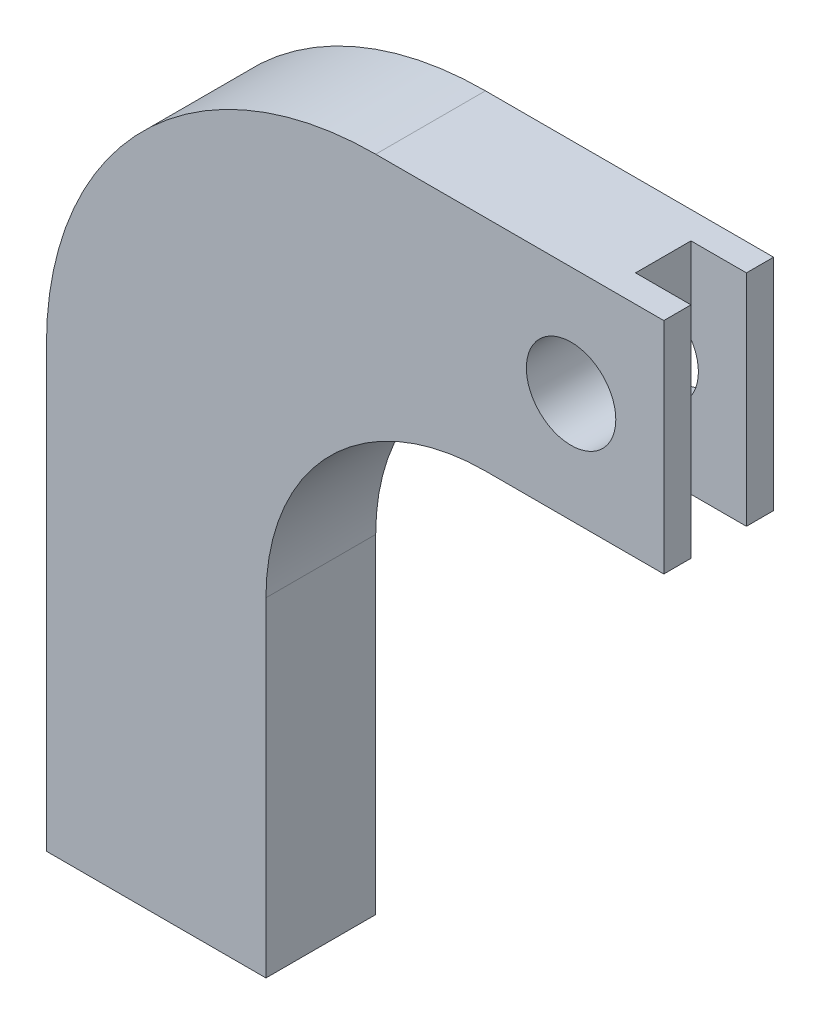
ISO-10303-21;
HEADER;
FILE_DESCRIPTION(('STEP AP214'),'2;1');
FILE_NAME('part.step','',(''),(''),'','','');
FILE_SCHEMA(('AUTOMOTIVE_DESIGN { 1 0 10303 214 1 1 1 1 }'));
ENDSEC;
DATA;
#1=APPLICATION_CONTEXT('core data for automotive mechanical design processes');
#2=APPLICATION_PROTOCOL_DEFINITION('international standard','automotive_design',2000,#1);
#3=PRODUCT_CONTEXT('',#1,'mechanical');
#4=PRODUCT('Part','Part','',(#3));
#5=PRODUCT_RELATED_PRODUCT_CATEGORY('part','',(#4));
#6=PRODUCT_DEFINITION_FORMATION('','',#4);
#7=PRODUCT_DEFINITION_CONTEXT('part definition',#1,'design');
#8=PRODUCT_DEFINITION('design','',#6,#7);
#9=PRODUCT_DEFINITION_SHAPE('','',#8);
#10=(LENGTH_UNIT() NAMED_UNIT(*) SI_UNIT(.MILLI.,.METRE.));
#11=(NAMED_UNIT(*) PLANE_ANGLE_UNIT() SI_UNIT($,.RADIAN.));
#12=(NAMED_UNIT(*) SI_UNIT($,.STERADIAN.) SOLID_ANGLE_UNIT());
#13=UNCERTAINTY_MEASURE_WITH_UNIT(LENGTH_MEASURE(1.E-05),#10,'distance_accuracy_value','');
#14=(GEOMETRIC_REPRESENTATION_CONTEXT(3) GLOBAL_UNCERTAINTY_ASSIGNED_CONTEXT((#13)) GLOBAL_UNIT_ASSIGNED_CONTEXT((#10,
#11,#12)) REPRESENTATION_CONTEXT('',''));
#15=CARTESIAN_POINT('',(0.,0.,0.));
#16=DIRECTION('',(0.,0.,1.));
#17=DIRECTION('',(1.,0.,0.));
#18=AXIS2_PLACEMENT_3D('',#15,#16,#17);
#19=CARTESIAN_POINT('',(11.25,14.,1.));
#20=DIRECTION('',(-1.,0.,0.));
#21=DIRECTION('',(0.,-1.,0.));
#22=AXIS2_PLACEMENT_3D('',#19,#20,#21);
#23=PLANE('',#22);
#24=DIRECTION('',(0.,0.,-1.));
#25=VECTOR('',#24,1.);
#26=CARTESIAN_POINT('',(11.25,10.,1.));
#27=LINE('',#26,#25);
#28=CARTESIAN_POINT('',(11.25,10.,1.));
#29=VERTEX_POINT('',#28);
#30=CARTESIAN_POINT('',(11.25,10.,0.505));
#31=VERTEX_POINT('',#30);
#32=EDGE_CURVE('E226',#29,#31,#27,.T.);
#33=ORIENTED_EDGE('',*,*,#32,.T.);
#34=DIRECTION('',(0.,-1.,0.));
#35=VECTOR('',#34,1.);
#36=CARTESIAN_POINT('',(11.25,14.,0.505));
#37=LINE('',#36,#35);
#38=CARTESIAN_POINT('',(11.25,14.,0.505));
#39=VERTEX_POINT('',#38);
#40=EDGE_CURVE('E149',#39,#31,#37,.T.);
#41=ORIENTED_EDGE('',*,*,#40,.F.);
#42=DIRECTION('',(0.,0.,-1.));
#43=VECTOR('',#42,1.);
#44=CARTESIAN_POINT('',(11.25,14.,1.));
#45=LINE('',#44,#43);
#46=CARTESIAN_POINT('',(11.25,14.,1.));
#47=VERTEX_POINT('',#46);
#48=EDGE_CURVE('E222',#47,#39,#45,.T.);
#49=ORIENTED_EDGE('',*,*,#48,.F.);
#50=DIRECTION('',(0.,1.,0.));
#51=VECTOR('',#50,1.);
#52=CARTESIAN_POINT('',(11.25,14.,1.));
#53=LINE('',#52,#51);
#54=EDGE_CURVE('E187',#29,#47,#53,.T.);
#55=ORIENTED_EDGE('',*,*,#54,.F.);
#56=EDGE_LOOP('',(#33,#41,#49,#55));
#57=FACE_BOUND('',#56,.T.);
#58=ADVANCED_FACE('F32',(#57),#23,.F.);
#59=CARTESIAN_POINT('',(9.56,12.,1.));
#60=DIRECTION('',(0.,0.,-1.));
#61=DIRECTION('',(-1.,0.,0.));
#62=AXIS2_PLACEMENT_3D('',#59,#60,#61);
#63=CYLINDRICAL_SURFACE('',#62,0.814999999999999);
#64=CARTESIAN_POINT('',(9.56,12.,1.));
#65=DIRECTION('',(0.,0.,1.));
#66=DIRECTION('',(1.,0.,0.));
#67=AXIS2_PLACEMENT_3D('',#64,#65,#66);
#68=CIRCLE('',#67,0.814999999999999);
#69=CARTESIAN_POINT('',(10.375,12.,1.));
#70=VERTEX_POINT('',#69);
#71=EDGE_CURVE('E171',#70,#70,#68,.T.);
#72=ORIENTED_EDGE('',*,*,#71,.T.);
#73=EDGE_LOOP('',(#72));
#74=FACE_BOUND('',#73,.T.);
#75=CARTESIAN_POINT('',(9.56,12.,-1.));
#76=DIRECTION('',(0.,0.,1.));
#77=DIRECTION('',(1.,0.,0.));
#78=AXIS2_PLACEMENT_3D('',#75,#76,#77);
#79=CIRCLE('',#78,0.814999999999999);
#80=CARTESIAN_POINT('',(10.375,12.,-1.));
#81=VERTEX_POINT('',#80);
#82=EDGE_CURVE('E168',#81,#81,#79,.T.);
#83=ORIENTED_EDGE('',*,*,#82,.F.);
#84=EDGE_LOOP('',(#83));
#85=FACE_BOUND('',#84,.T.);
#86=CARTESIAN_POINT('',(9.56,12.,0.505));
#87=DIRECTION('',(0.,0.,1.));
#88=DIRECTION('',(0.,-1.,0.));
#89=AXIS2_PLACEMENT_3D('',#86,#87,#88);
#90=CIRCLE('',#89,0.814999999999999);
#91=CARTESIAN_POINT('',(10.24,11.5507506260438,0.505));
#92=VERTEX_POINT('',#91);
#93=CARTESIAN_POINT('',(10.24,12.4492493739562,0.505));
#94=VERTEX_POINT('',#93);
#95=EDGE_CURVE('E40',#92,#94,#90,.T.);
#96=ORIENTED_EDGE('',*,*,#95,.F.);
#97=DIRECTION('',(0.,0.,-1.));
#98=VECTOR('',#97,1.);
#99=CARTESIAN_POINT('',(10.24,11.5507506260438,1.));
#100=LINE('',#99,#98);
#101=CARTESIAN_POINT('',(10.24,11.5507506260438,-0.505));
#102=VERTEX_POINT('',#101);
#103=EDGE_CURVE('E11',#92,#102,#100,.T.);
#104=ORIENTED_EDGE('',*,*,#103,.T.);
#105=CARTESIAN_POINT('',(9.56,12.,-0.505));
#106=DIRECTION('',(0.,0.,-1.));
#107=DIRECTION('',(0.,1.,0.));
#108=AXIS2_PLACEMENT_3D('',#105,#106,#107);
#109=CIRCLE('',#108,0.814999999999999);
#110=CARTESIAN_POINT('',(10.24,12.4492493739562,-0.505));
#111=VERTEX_POINT('',#110);
#112=EDGE_CURVE('E240',#111,#102,#109,.T.);
#113=ORIENTED_EDGE('',*,*,#112,.F.);
#114=DIRECTION('',(0.,0.,-1.));
#115=VECTOR('',#114,1.);
#116=CARTESIAN_POINT('',(10.24,12.4492493739562,1.));
#117=LINE('',#116,#115);
#118=EDGE_CURVE('E237',#111,#94,#117,.F.);
#119=ORIENTED_EDGE('',*,*,#118,.T.);
#120=EDGE_LOOP('',(#96,#104,#113,#119));
#121=FACE_BOUND('',#120,.T.);
#122=ADVANCED_FACE('F243',(#74,#85,#121),#63,.F.);
#123=CARTESIAN_POINT('',(6.,8.,1.));
#124=DIRECTION('',(0.,0.,-1.));
#125=DIRECTION('',(-1.,0.,0.));
#126=AXIS2_PLACEMENT_3D('',#123,#124,#125);
#127=PLANE('',#126);
#128=DIRECTION('',(1.,0.,0.));
#129=VECTOR('',#128,1.);
#130=CARTESIAN_POINT('',(4.,0.,1.));
#131=LINE('',#130,#129);
#132=CARTESIAN_POINT('',(0.,0.,1.));
#133=VERTEX_POINT('',#132);
#134=CARTESIAN_POINT('',(4.,0.,1.));
#135=VERTEX_POINT('',#134);
#136=EDGE_CURVE('E177',#133,#135,#131,.T.);
#137=ORIENTED_EDGE('',*,*,#136,.T.);
#138=DIRECTION('',(0.,1.,0.));
#139=VECTOR('',#138,1.);
#140=CARTESIAN_POINT('',(4.,5.99999999999997,1.));
#141=LINE('',#140,#139);
#142=CARTESIAN_POINT('',(4.,5.99999999999997,1.));
#143=VERTEX_POINT('',#142);
#144=EDGE_CURVE('E180',#135,#143,#141,.T.);
#145=ORIENTED_EDGE('',*,*,#144,.T.);
#146=CARTESIAN_POINT('',(8.,6.,1.));
#147=DIRECTION('',(0.,0.,-1.));
#148=DIRECTION('',(1.,0.,0.));
#149=AXIS2_PLACEMENT_3D('',#146,#147,#148);
#150=CIRCLE('',#149,4.);
#151=CARTESIAN_POINT('',(8.00000000000003,10.,1.));
#152=VERTEX_POINT('',#151);
#153=EDGE_CURVE('E183',#143,#152,#150,.T.);
#154=ORIENTED_EDGE('',*,*,#153,.T.);
#155=DIRECTION('',(1.,0.,0.));
#156=VECTOR('',#155,1.);
#157=CARTESIAN_POINT('',(11.25,10.,1.));
#158=LINE('',#157,#156);
#159=EDGE_CURVE('E185',#152,#29,#158,.T.);
#160=ORIENTED_EDGE('',*,*,#159,.T.);
#161=ORIENTED_EDGE('',*,*,#54,.T.);
#162=DIRECTION('',(-1.,0.,0.));
#163=VECTOR('',#162,1.);
#164=CARTESIAN_POINT('',(6.,14.,1.));
#165=LINE('',#164,#163);
#166=CARTESIAN_POINT('',(6.,14.,1.));
#167=VERTEX_POINT('',#166);
#168=EDGE_CURVE('E189',#47,#167,#165,.T.);
#169=ORIENTED_EDGE('',*,*,#168,.T.);
#170=CARTESIAN_POINT('',(6.,8.,1.));
#171=DIRECTION('',(0.,0.,1.));
#172=DIRECTION('',(-1.,0.,0.));
#173=AXIS2_PLACEMENT_3D('',#170,#171,#172);
#174=CIRCLE('',#173,6.);
#175=CARTESIAN_POINT('',(0.,8.,1.));
#176=VERTEX_POINT('',#175);
#177=EDGE_CURVE('E191',#167,#176,#174,.T.);
#178=ORIENTED_EDGE('',*,*,#177,.T.);
#179=DIRECTION('',(0.,-1.,0.));
#180=VECTOR('',#179,1.);
#181=CARTESIAN_POINT('',(0.,0.,1.));
#182=LINE('',#181,#180);
#183=EDGE_CURVE('E193',#176,#133,#182,.T.);
#184=ORIENTED_EDGE('',*,*,#183,.T.);
#185=EDGE_LOOP('',(#137,#145,#154,#160,#161,#169,#178,#184));
#186=FACE_BOUND('',#185,.T.);
#187=ORIENTED_EDGE('',*,*,#71,.F.);
#188=EDGE_LOOP('',(#187));
#189=FACE_BOUND('',#188,.T.);
#190=ADVANCED_FACE('F273',(#186,#189),#127,.F.);
#191=CARTESIAN_POINT('',(6.,8.,-1.));
#192=DIRECTION('',(0.,0.,-1.));
#193=DIRECTION('',(-1.,0.,0.));
#194=AXIS2_PLACEMENT_3D('',#191,#192,#193);
#195=PLANE('',#194);
#196=DIRECTION('',(1.,0.,0.));
#197=VECTOR('',#196,1.);
#198=CARTESIAN_POINT('',(4.,0.,-1.));
#199=LINE('',#198,#197);
#200=CARTESIAN_POINT('',(0.,0.,-1.));
#201=VERTEX_POINT('',#200);
#202=CARTESIAN_POINT('',(4.,0.,-1.));
#203=VERTEX_POINT('',#202);
#204=EDGE_CURVE('E174',#201,#203,#199,.T.);
#205=ORIENTED_EDGE('',*,*,#204,.F.);
#206=DIRECTION('',(0.,-1.,0.));
#207=VECTOR('',#206,1.);
#208=CARTESIAN_POINT('',(0.,0.,-1.));
#209=LINE('',#208,#207);
#210=CARTESIAN_POINT('',(0.,8.,-1.));
#211=VERTEX_POINT('',#210);
#212=EDGE_CURVE('E181',#211,#201,#209,.T.);
#213=ORIENTED_EDGE('',*,*,#212,.F.);
#214=CARTESIAN_POINT('',(6.,8.,-1.));
#215=DIRECTION('',(0.,0.,1.));
#216=DIRECTION('',(-1.,0.,0.));
#217=AXIS2_PLACEMENT_3D('',#214,#215,#216);
#218=CIRCLE('',#217,6.);
#219=CARTESIAN_POINT('',(6.,14.,-1.));
#220=VERTEX_POINT('',#219);
#221=EDGE_CURVE('E210',#220,#211,#218,.T.);
#222=ORIENTED_EDGE('',*,*,#221,.F.);
#223=DIRECTION('',(-1.,0.,0.));
#224=VECTOR('',#223,1.);
#225=CARTESIAN_POINT('',(6.,14.,-1.));
#226=LINE('',#225,#224);
#227=CARTESIAN_POINT('',(11.25,14.,-1.));
#228=VERTEX_POINT('',#227);
#229=EDGE_CURVE('E208',#228,#220,#226,.T.);
#230=ORIENTED_EDGE('',*,*,#229,.F.);
#231=DIRECTION('',(0.,1.,0.));
#232=VECTOR('',#231,1.);
#233=CARTESIAN_POINT('',(11.25,14.,-1.));
#234=LINE('',#233,#232);
#235=CARTESIAN_POINT('',(11.25,10.,-1.));
#236=VERTEX_POINT('',#235);
#237=EDGE_CURVE('E205',#236,#228,#234,.T.);
#238=ORIENTED_EDGE('',*,*,#237,.F.);
#239=DIRECTION('',(1.,0.,0.));
#240=VECTOR('',#239,1.);
#241=CARTESIAN_POINT('',(11.25,10.,-1.));
#242=LINE('',#241,#240);
#243=CARTESIAN_POINT('',(8.00000000000003,10.,-1.));
#244=VERTEX_POINT('',#243);
#245=EDGE_CURVE('E202',#244,#236,#242,.T.);
#246=ORIENTED_EDGE('',*,*,#245,.F.);
#247=CARTESIAN_POINT('',(8.,6.,-1.));
#248=DIRECTION('',(0.,0.,-1.));
#249=DIRECTION('',(1.,0.,0.));
#250=AXIS2_PLACEMENT_3D('',#247,#248,#249);
#251=CIRCLE('',#250,4.);
#252=CARTESIAN_POINT('',(4.,5.99999999999997,-1.));
#253=VERTEX_POINT('',#252);
#254=EDGE_CURVE('E200',#253,#244,#251,.T.);
#255=ORIENTED_EDGE('',*,*,#254,.F.);
#256=DIRECTION('',(0.,1.,0.));
#257=VECTOR('',#256,1.);
#258=CARTESIAN_POINT('',(4.,5.99999999999997,-1.));
#259=LINE('',#258,#257);
#260=EDGE_CURVE('E198',#203,#253,#259,.T.);
#261=ORIENTED_EDGE('',*,*,#260,.F.);
#262=EDGE_LOOP('',(#205,#213,#222,#230,#238,#246,#255,#261));
#263=FACE_BOUND('',#262,.T.);
#264=ORIENTED_EDGE('',*,*,#82,.T.);
#265=EDGE_LOOP('',(#264));
#266=FACE_BOUND('',#265,.T.);
#267=ADVANCED_FACE('F259',(#263,#266),#195,.T.);
#268=CARTESIAN_POINT('',(4.,0.,1.));
#269=DIRECTION('',(0.,1.,0.));
#270=DIRECTION('',(-1.,0.,0.));
#271=AXIS2_PLACEMENT_3D('',#268,#269,#270);
#272=PLANE('',#271);
#273=ORIENTED_EDGE('',*,*,#204,.T.);
#274=DIRECTION('',(0.,0.,-1.));
#275=VECTOR('',#274,1.);
#276=CARTESIAN_POINT('',(4.,0.,1.));
#277=LINE('',#276,#275);
#278=EDGE_CURVE('E234',#135,#203,#277,.T.);
#279=ORIENTED_EDGE('',*,*,#278,.F.);
#280=ORIENTED_EDGE('',*,*,#136,.F.);
#281=DIRECTION('',(0.,0.,-1.));
#282=VECTOR('',#281,1.);
#283=CARTESIAN_POINT('',(0.,0.,1.));
#284=LINE('',#283,#282);
#285=EDGE_CURVE('E195',#133,#201,#284,.T.);
#286=ORIENTED_EDGE('',*,*,#285,.T.);
#287=EDGE_LOOP('',(#273,#279,#280,#286));
#288=FACE_BOUND('',#287,.T.);
#289=ADVANCED_FACE('F34',(#288),#272,.F.);
#290=CARTESIAN_POINT('',(4.,5.99999999999997,1.));
#291=DIRECTION('',(-1.,0.,0.));
#292=DIRECTION('',(0.,0.,1.));
#293=AXIS2_PLACEMENT_3D('',#290,#291,#292);
#294=PLANE('',#293);
#295=ORIENTED_EDGE('',*,*,#260,.T.);
#296=DIRECTION('',(0.,0.,-1.));
#297=VECTOR('',#296,1.);
#298=CARTESIAN_POINT('',(4.,5.99999999999997,1.));
#299=LINE('',#298,#297);
#300=EDGE_CURVE('E231',#143,#253,#299,.T.);
#301=ORIENTED_EDGE('',*,*,#300,.F.);
#302=ORIENTED_EDGE('',*,*,#144,.F.);
#303=ORIENTED_EDGE('',*,*,#278,.T.);
#304=EDGE_LOOP('',(#295,#301,#302,#303));
#305=FACE_BOUND('',#304,.T.);
#306=ADVANCED_FACE('F286',(#305),#294,.F.);
#307=CARTESIAN_POINT('',(8.,6.,1.));
#308=DIRECTION('',(0.,0.,-1.));
#309=DIRECTION('',(-1.,0.,0.));
#310=AXIS2_PLACEMENT_3D('',#307,#308,#309);
#311=CYLINDRICAL_SURFACE('',#310,4.);
#312=ORIENTED_EDGE('',*,*,#254,.T.);
#313=DIRECTION('',(0.,0.,-1.));
#314=VECTOR('',#313,1.);
#315=CARTESIAN_POINT('',(8.00000000000003,10.,1.));
#316=LINE('',#315,#314);
#317=EDGE_CURVE('E228',#152,#244,#316,.T.);
#318=ORIENTED_EDGE('',*,*,#317,.F.);
#319=ORIENTED_EDGE('',*,*,#153,.F.);
#320=ORIENTED_EDGE('',*,*,#300,.T.);
#321=EDGE_LOOP('',(#312,#318,#319,#320));
#322=FACE_BOUND('',#321,.T.);
#323=ADVANCED_FACE('F283',(#322),#311,.F.);
#324=CARTESIAN_POINT('',(11.25,10.,1.));
#325=DIRECTION('',(0.,1.,0.));
#326=DIRECTION('',(0.,0.,1.));
#327=AXIS2_PLACEMENT_3D('',#324,#325,#326);
#328=PLANE('',#327);
#329=DIRECTION('',(0.,0.,-1.));
#330=VECTOR('',#329,1.);
#331=CARTESIAN_POINT('',(10.24,10.,0.505));
#332=LINE('',#331,#330);
#333=CARTESIAN_POINT('',(10.24,10.,0.505));
#334=VERTEX_POINT('',#333);
#335=CARTESIAN_POINT('',(10.24,10.,-0.505000000000001));
#336=VERTEX_POINT('',#335);
#337=EDGE_CURVE('E139',#334,#336,#332,.T.);
#338=ORIENTED_EDGE('',*,*,#337,.F.);
#339=DIRECTION('',(1.,0.,0.));
#340=VECTOR('',#339,1.);
#341=CARTESIAN_POINT('',(10.24,10.,0.505));
#342=LINE('',#341,#340);
#343=EDGE_CURVE('E146',#334,#31,#342,.T.);
#344=ORIENTED_EDGE('',*,*,#343,.T.);
#345=ORIENTED_EDGE('',*,*,#32,.F.);
#346=ORIENTED_EDGE('',*,*,#159,.F.);
#347=ORIENTED_EDGE('',*,*,#317,.T.);
#348=ORIENTED_EDGE('',*,*,#245,.T.);
#349=CARTESIAN_POINT('',(11.25,10.,-0.505000000000001));
#350=VERTEX_POINT('',#349);
#351=EDGE_CURVE('E225',#350,#236,#27,.T.);
#352=ORIENTED_EDGE('',*,*,#351,.F.);
#353=DIRECTION('',(1.,0.,0.));
#354=VECTOR('',#353,1.);
#355=CARTESIAN_POINT('',(10.24,10.,-0.505000000000001));
#356=LINE('',#355,#354);
#357=EDGE_CURVE('E153',#336,#350,#356,.T.);
#358=ORIENTED_EDGE('',*,*,#357,.F.);
#359=EDGE_LOOP('',(#338,#344,#345,#346,#347,#348,#352,#358));
#360=FACE_BOUND('',#359,.T.);
#361=ADVANCED_FACE('F156',(#360),#328,.F.);
#362=CARTESIAN_POINT('',(11.25,14.,-0.505));
#363=VERTEX_POINT('',#362);
#364=EDGE_CURVE('E221',#363,#228,#45,.T.);
#365=ORIENTED_EDGE('',*,*,#364,.F.);
#366=DIRECTION('',(0.,1.,0.));
#367=VECTOR('',#366,1.);
#368=CARTESIAN_POINT('',(11.25,14.,-0.505));
#369=LINE('',#368,#367);
#370=EDGE_CURVE('E143',#350,#363,#369,.T.);
#371=ORIENTED_EDGE('',*,*,#370,.F.);
#372=ORIENTED_EDGE('',*,*,#351,.T.);
#373=ORIENTED_EDGE('',*,*,#237,.T.);
#374=EDGE_LOOP('',(#365,#371,#372,#373));
#375=FACE_BOUND('',#374,.T.);
#376=ADVANCED_FACE('F250',(#375),#23,.F.);
#377=CARTESIAN_POINT('',(6.,14.,1.));
#378=DIRECTION('',(0.,-1.,0.));
#379=DIRECTION('',(1.,0.,0.));
#380=AXIS2_PLACEMENT_3D('',#377,#378,#379);
#381=PLANE('',#380);
#382=ORIENTED_EDGE('',*,*,#48,.T.);
#383=DIRECTION('',(1.,0.,0.));
#384=VECTOR('',#383,1.);
#385=CARTESIAN_POINT('',(10.24,14.,0.505));
#386=LINE('',#385,#384);
#387=CARTESIAN_POINT('',(10.24,14.,0.505));
#388=VERTEX_POINT('',#387);
#389=EDGE_CURVE('E166',#388,#39,#386,.T.);
#390=ORIENTED_EDGE('',*,*,#389,.F.);
#391=DIRECTION('',(0.,0.,1.));
#392=VECTOR('',#391,1.);
#393=CARTESIAN_POINT('',(10.24,14.,0.505));
#394=LINE('',#393,#392);
#395=CARTESIAN_POINT('',(10.24,14.,-0.505000000000001));
#396=VERTEX_POINT('',#395);
#397=EDGE_CURVE('E154',#396,#388,#394,.T.);
#398=ORIENTED_EDGE('',*,*,#397,.F.);
#399=DIRECTION('',(1.,0.,0.));
#400=VECTOR('',#399,1.);
#401=CARTESIAN_POINT('',(10.24,14.,-0.505));
#402=LINE('',#401,#400);
#403=EDGE_CURVE('E47',#396,#363,#402,.T.);
#404=ORIENTED_EDGE('',*,*,#403,.T.);
#405=ORIENTED_EDGE('',*,*,#364,.T.);
#406=ORIENTED_EDGE('',*,*,#229,.T.);
#407=DIRECTION('',(0.,0.,-1.));
#408=VECTOR('',#407,1.);
#409=CARTESIAN_POINT('',(6.,14.,1.));
#410=LINE('',#409,#408);
#411=EDGE_CURVE('E218',#167,#220,#410,.T.);
#412=ORIENTED_EDGE('',*,*,#411,.F.);
#413=ORIENTED_EDGE('',*,*,#168,.F.);
#414=EDGE_LOOP('',(#382,#390,#398,#404,#405,#406,#412,#413));
#415=FACE_BOUND('',#414,.T.);
#416=ADVANCED_FACE('F265',(#415),#381,.F.);
#417=CARTESIAN_POINT('',(6.,8.,1.));
#418=DIRECTION('',(0.,0.,-1.));
#419=DIRECTION('',(-1.,0.,0.));
#420=AXIS2_PLACEMENT_3D('',#417,#418,#419);
#421=CYLINDRICAL_SURFACE('',#420,6.);
#422=ORIENTED_EDGE('',*,*,#221,.T.);
#423=DIRECTION('',(0.,0.,-1.));
#424=VECTOR('',#423,1.);
#425=CARTESIAN_POINT('',(0.,8.,1.));
#426=LINE('',#425,#424);
#427=EDGE_CURVE('E215',#176,#211,#426,.T.);
#428=ORIENTED_EDGE('',*,*,#427,.F.);
#429=ORIENTED_EDGE('',*,*,#177,.F.);
#430=ORIENTED_EDGE('',*,*,#411,.T.);
#431=EDGE_LOOP('',(#422,#428,#429,#430));
#432=FACE_BOUND('',#431,.T.);
#433=ADVANCED_FACE('F269',(#432),#421,.T.);
#434=CARTESIAN_POINT('',(0.,0.,1.));
#435=DIRECTION('',(1.,0.,0.));
#436=DIRECTION('',(0.,0.,-1.));
#437=AXIS2_PLACEMENT_3D('',#434,#435,#436);
#438=PLANE('',#437);
#439=ORIENTED_EDGE('',*,*,#212,.T.);
#440=ORIENTED_EDGE('',*,*,#285,.F.);
#441=ORIENTED_EDGE('',*,*,#183,.F.);
#442=ORIENTED_EDGE('',*,*,#427,.T.);
#443=EDGE_LOOP('',(#439,#440,#441,#442));
#444=FACE_BOUND('',#443,.T.);
#445=ADVANCED_FACE('F290',(#444),#438,.F.);
#446=CARTESIAN_POINT('',(10.24,0.,0.));
#447=DIRECTION('',(1.,0.,0.));
#448=DIRECTION('',(0.,1.,0.));
#449=AXIS2_PLACEMENT_3D('',#446,#447,#448);
#450=PLANE('',#449);
#451=DIRECTION('',(0.,-1.,0.));
#452=VECTOR('',#451,1.);
#453=CARTESIAN_POINT('',(10.24,14.,0.505));
#454=LINE('',#453,#452);
#455=EDGE_CURVE('E134',#92,#334,#454,.T.);
#456=ORIENTED_EDGE('',*,*,#455,.T.);
#457=ORIENTED_EDGE('',*,*,#337,.T.);
#458=DIRECTION('',(0.,1.,0.));
#459=VECTOR('',#458,1.);
#460=CARTESIAN_POINT('',(10.24,14.,-0.505));
#461=LINE('',#460,#459);
#462=EDGE_CURVE('E160',#336,#102,#461,.T.);
#463=ORIENTED_EDGE('',*,*,#462,.T.);
#464=ORIENTED_EDGE('',*,*,#103,.F.);
#465=EDGE_LOOP('',(#456,#457,#463,#464));
#466=FACE_BOUND('',#465,.T.);
#467=ADVANCED_FACE('F136',(#466),#450,.T.);
#468=CARTESIAN_POINT('',(10.24,14.,0.505));
#469=DIRECTION('',(0.,0.,1.));
#470=DIRECTION('',(0.,-1.,0.));
#471=AXIS2_PLACEMENT_3D('',#468,#469,#470);
#472=PLANE('',#471);
#473=ORIENTED_EDGE('',*,*,#95,.T.);
#474=EDGE_CURVE('E55',#388,#94,#454,.T.);
#475=ORIENTED_EDGE('',*,*,#474,.F.);
#476=ORIENTED_EDGE('',*,*,#389,.T.);
#477=ORIENTED_EDGE('',*,*,#40,.T.);
#478=ORIENTED_EDGE('',*,*,#343,.F.);
#479=ORIENTED_EDGE('',*,*,#455,.F.);
#480=EDGE_LOOP('',(#473,#475,#476,#477,#478,#479));
#481=FACE_BOUND('',#480,.T.);
#482=ADVANCED_FACE('F147',(#481),#472,.F.);
#483=CARTESIAN_POINT('',(10.24,14.,-0.505));
#484=DIRECTION('',(0.,0.,-1.));
#485=DIRECTION('',(0.,1.,0.));
#486=AXIS2_PLACEMENT_3D('',#483,#484,#485);
#487=PLANE('',#486);
#488=ORIENTED_EDGE('',*,*,#112,.T.);
#489=ORIENTED_EDGE('',*,*,#462,.F.);
#490=ORIENTED_EDGE('',*,*,#357,.T.);
#491=ORIENTED_EDGE('',*,*,#370,.T.);
#492=ORIENTED_EDGE('',*,*,#403,.F.);
#493=EDGE_CURVE('E158',#111,#396,#461,.T.);
#494=ORIENTED_EDGE('',*,*,#493,.F.);
#495=EDGE_LOOP('',(#488,#489,#490,#491,#492,#494));
#496=FACE_BOUND('',#495,.T.);
#497=ADVANCED_FACE('F246',(#496),#487,.F.);
#498=ORIENTED_EDGE('',*,*,#493,.T.);
#499=ORIENTED_EDGE('',*,*,#397,.T.);
#500=ORIENTED_EDGE('',*,*,#474,.T.);
#501=ORIENTED_EDGE('',*,*,#118,.F.);
#502=EDGE_LOOP('',(#498,#499,#500,#501));
#503=FACE_BOUND('',#502,.T.);
#504=ADVANCED_FACE('F244',(#503),#450,.T.);
#505=CLOSED_SHELL('',(#58,#122,#190,#267,#289,#306,#323,#361,#376,#416,#433,#445,#467,#482,#497,#504));
#506=MANIFOLD_SOLID_BREP('B2',#505);
#507=ADVANCED_BREP_SHAPE_REPRESENTATION('',(#18,#506),#14);
#508=SHAPE_DEFINITION_REPRESENTATION(#9,#507);
ENDSEC;
END-ISO-10303-21;
